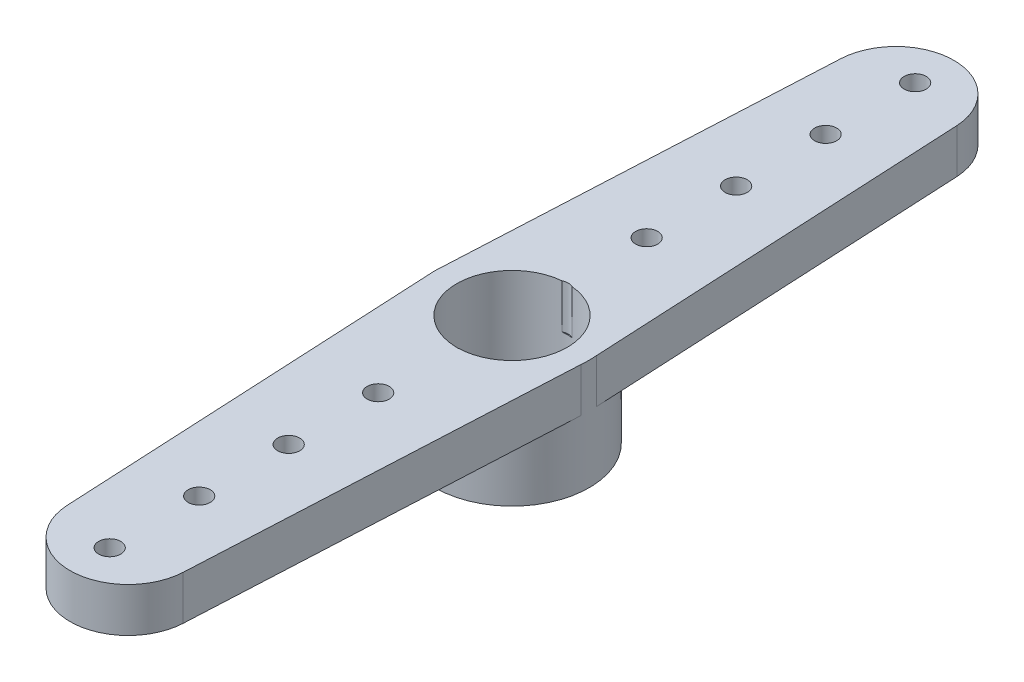
ISO-10303-21;
HEADER;
FILE_DESCRIPTION(('STEP AP214'),'2;1');
FILE_NAME('part.step','',(''),(''),'','','');
FILE_SCHEMA(('AUTOMOTIVE_DESIGN { 1 0 10303 214 1 1 1 1 }'));
ENDSEC;
DATA;
#1=APPLICATION_CONTEXT('core data for automotive mechanical design processes');
#2=APPLICATION_PROTOCOL_DEFINITION('international standard','automotive_design',2000,#1);
#3=PRODUCT_CONTEXT('',#1,'mechanical');
#4=PRODUCT('Part','Part','',(#3));
#5=PRODUCT_RELATED_PRODUCT_CATEGORY('part','',(#4));
#6=PRODUCT_DEFINITION_FORMATION('','',#4);
#7=PRODUCT_DEFINITION_CONTEXT('part definition',#1,'design');
#8=PRODUCT_DEFINITION('design','',#6,#7);
#9=PRODUCT_DEFINITION_SHAPE('','',#8);
#10=(LENGTH_UNIT() NAMED_UNIT(*) SI_UNIT(.MILLI.,.METRE.));
#11=(NAMED_UNIT(*) PLANE_ANGLE_UNIT() SI_UNIT($,.RADIAN.));
#12=(NAMED_UNIT(*) SI_UNIT($,.STERADIAN.) SOLID_ANGLE_UNIT());
#13=UNCERTAINTY_MEASURE_WITH_UNIT(LENGTH_MEASURE(1.E-05),#10,'distance_accuracy_value','');
#14=(GEOMETRIC_REPRESENTATION_CONTEXT(3) GLOBAL_UNCERTAINTY_ASSIGNED_CONTEXT((#13)) GLOBAL_UNIT_ASSIGNED_CONTEXT((#10,
#11,#12)) REPRESENTATION_CONTEXT('',''));
#15=CARTESIAN_POINT('',(0.,0.,0.));
#16=DIRECTION('',(0.,0.,1.));
#17=DIRECTION('',(1.,0.,0.));
#18=AXIS2_PLACEMENT_3D('',#15,#16,#17);
#19=CARTESIAN_POINT('',(0.,0.5,2.00608041372438));
#20=DIRECTION('',(0.,1.,0.));
#21=DIRECTION('',(0.,0.,1.));
#22=AXIS2_PLACEMENT_3D('',#19,#20,#21);
#23=CYLINDRICAL_SURFACE('',#22,0.5);
#24=DIRECTION('',(0.,-1.,0.));
#25=VECTOR('',#24,1.);
#26=CARTESIAN_POINT('',(-0.0867705995829963,2.5,2.49849371883301));
#27=LINE('',#26,#25);
#28=CARTESIAN_POINT('',(-0.0867705995829963,2.5,2.49849371883301));
#29=VERTEX_POINT('',#28);
#30=CARTESIAN_POINT('',(-0.0867705995829963,0.5,2.49849371883301));
#31=VERTEX_POINT('',#30);
#32=EDGE_CURVE('E383',#29,#31,#27,.T.);
#33=ORIENTED_EDGE('',*,*,#32,.F.);
#34=CARTESIAN_POINT('',(0.,2.5,2.00608041372438));
#35=DIRECTION('',(0.,1.,0.));
#36=DIRECTION('',(0.,0.,1.));
#37=AXIS2_PLACEMENT_3D('',#34,#35,#36);
#38=CIRCLE('',#37,0.5);
#39=CARTESIAN_POINT('',(0.0867705995829963,2.5,2.49849371883301));
#40=VERTEX_POINT('',#39);
#41=EDGE_CURVE('E410',#29,#40,#38,.T.);
#42=ORIENTED_EDGE('',*,*,#41,.T.);
#43=DIRECTION('',(0.,-1.,0.));
#44=VECTOR('',#43,1.);
#45=CARTESIAN_POINT('',(0.0867705995829963,2.5,2.49849371883301));
#46=LINE('',#45,#44);
#47=CARTESIAN_POINT('',(0.0867705995829963,0.5,2.49849371883301));
#48=VERTEX_POINT('',#47);
#49=EDGE_CURVE('E382',#48,#40,#46,.F.);
#50=ORIENTED_EDGE('',*,*,#49,.F.);
#51=CARTESIAN_POINT('',(0.,0.5,0.));
#52=DIRECTION('',(0.,1.,0.));
#53=DIRECTION('',(-0.0347082398331937,0.,0.999397487533204));
#54=AXIS2_PLACEMENT_3D('',#51,#52,#53);
#55=CIRCLE('',#54,2.5);
#56=EDGE_CURVE('E160',#31,#48,#55,.T.);
#57=ORIENTED_EDGE('',*,*,#56,.F.);
#58=EDGE_LOOP('',(#33,#42,#50,#57));
#59=FACE_BOUND('',#58,.T.);
#60=ADVANCED_FACE('F42',(#59),#23,.F.);
#61=CARTESIAN_POINT('',(0.,0.5,-2.04391958627562));
#62=DIRECTION('',(0.,1.,0.));
#63=DIRECTION('',(0.,0.,1.));
#64=AXIS2_PLACEMENT_3D('',#61,#62,#63);
#65=CYLINDRICAL_SURFACE('',#64,0.5);
#66=DIRECTION('',(0.,-1.,0.));
#67=VECTOR('',#66,1.);
#68=CARTESIAN_POINT('',(0.226395537594533,2.5,-2.48972790894051));
#69=LINE('',#68,#67);
#70=CARTESIAN_POINT('',(0.226395537594534,2.5,-2.48972790894051));
#71=VERTEX_POINT('',#70);
#72=CARTESIAN_POINT('',(0.226395537594533,0.5,-2.48972790894051));
#73=VERTEX_POINT('',#72);
#74=EDGE_CURVE('E139',#71,#73,#69,.T.);
#75=ORIENTED_EDGE('',*,*,#74,.F.);
#76=CARTESIAN_POINT('',(0.,2.5,-2.04391958627562));
#77=DIRECTION('',(0.,1.,0.));
#78=DIRECTION('',(0.,0.,1.));
#79=AXIS2_PLACEMENT_3D('',#76,#77,#78);
#80=CIRCLE('',#79,0.5);
#81=CARTESIAN_POINT('',(-0.226395537594533,2.5,-2.48972790894051));
#82=VERTEX_POINT('',#81);
#83=EDGE_CURVE('E156',#71,#82,#80,.T.);
#84=ORIENTED_EDGE('',*,*,#83,.T.);
#85=DIRECTION('',(0.,-1.,0.));
#86=VECTOR('',#85,1.);
#87=CARTESIAN_POINT('',(-0.226395537594533,2.5,-2.48972790894051));
#88=LINE('',#87,#86);
#89=CARTESIAN_POINT('',(-0.226395537594531,0.5,-2.48972790894051));
#90=VERTEX_POINT('',#89);
#91=EDGE_CURVE('E149',#90,#82,#88,.F.);
#92=ORIENTED_EDGE('',*,*,#91,.F.);
#93=CARTESIAN_POINT('',(0.,0.5,-2.04391958627562));
#94=DIRECTION('',(0.,1.,0.));
#95=DIRECTION('',(0.,0.,1.));
#96=AXIS2_PLACEMENT_3D('',#93,#94,#95);
#97=CIRCLE('',#96,0.5);
#98=EDGE_CURVE('E152',#73,#90,#97,.T.);
#99=ORIENTED_EDGE('',*,*,#98,.F.);
#100=EDGE_LOOP('',(#75,#84,#92,#99));
#101=FACE_BOUND('',#100,.T.);
#102=ADVANCED_FACE('F153',(#101),#65,.F.);
#103=CARTESIAN_POINT('',(0.,2.5,17.3718769506874));
#104=DIRECTION('',(0.,1.,0.));
#105=DIRECTION('',(0.,0.,1.));
#106=AXIS2_PLACEMENT_3D('',#103,#104,#105);
#107=CYLINDRICAL_SURFACE('',#106,2.6281230493126);
#108=DIRECTION('',(0.,1.,0.));
#109=VECTOR('',#108,1.);
#110=CARTESIAN_POINT('',(2.62484404235973,0.5,17.5031191528054));
#111=LINE('',#110,#109);
#112=CARTESIAN_POINT('',(2.62484404235973,2.5,17.5031191528054));
#113=VERTEX_POINT('',#112);
#114=CARTESIAN_POINT('',(2.62484404235973,0.5,17.5031191528054));
#115=VERTEX_POINT('',#114);
#116=EDGE_CURVE('E376',#113,#115,#111,.F.);
#117=ORIENTED_EDGE('',*,*,#116,.F.);
#118=CARTESIAN_POINT('',(0.,2.5,17.3718769506874));
#119=DIRECTION('',(0.,1.,0.));
#120=DIRECTION('',(0.,0.,1.));
#121=AXIS2_PLACEMENT_3D('',#118,#119,#120);
#122=CIRCLE('',#121,2.6281230493126);
#123=CARTESIAN_POINT('',(-2.62484404235973,2.5,17.5031191528054));
#124=VERTEX_POINT('',#123);
#125=EDGE_CURVE('E54',#124,#113,#122,.T.);
#126=ORIENTED_EDGE('',*,*,#125,.F.);
#127=DIRECTION('',(0.,1.,0.));
#128=VECTOR('',#127,1.);
#129=CARTESIAN_POINT('',(-2.62484404235973,0.5,17.5031191528054));
#130=LINE('',#129,#128);
#131=CARTESIAN_POINT('',(-2.62484404235973,0.5,17.5031191528054));
#132=VERTEX_POINT('',#131);
#133=EDGE_CURVE('E379',#132,#124,#130,.T.);
#134=ORIENTED_EDGE('',*,*,#133,.F.);
#135=CARTESIAN_POINT('',(0.,0.499999999999999,17.3718769506874));
#136=DIRECTION('',(0.,1.,0.));
#137=DIRECTION('',(0.,0.,1.));
#138=AXIS2_PLACEMENT_3D('',#135,#136,#137);
#139=CIRCLE('',#138,2.6281230493126);
#140=EDGE_CURVE('E12',#115,#132,#139,.F.);
#141=ORIENTED_EDGE('',*,*,#140,.F.);
#142=EDGE_LOOP('',(#117,#126,#134,#141));
#143=FACE_BOUND('',#142,.T.);
#144=ADVANCED_FACE('F45',(#143),#107,.T.);
#145=CARTESIAN_POINT('',(0.,2.5,0.));
#146=DIRECTION('',(0.,1.,0.));
#147=DIRECTION('',(0.,0.,1.));
#148=AXIS2_PLACEMENT_3D('',#145,#146,#147);
#149=PLANE('',#148);
#150=CARTESIAN_POINT('',(0.,2.5,-10.1439195862756));
#151=DIRECTION('',(0.,1.,0.));
#152=DIRECTION('',(0.,0.,1.));
#153=AXIS2_PLACEMENT_3D('',#150,#151,#152);
#154=CIRCLE('',#153,0.5);
#155=CARTESIAN_POINT('',(0.,2.5,-9.64391958627562));
#156=VERTEX_POINT('',#155);
#157=EDGE_CURVE('E401',#156,#156,#154,.T.);
#158=ORIENTED_EDGE('',*,*,#157,.F.);
#159=EDGE_LOOP('',(#158));
#160=FACE_BOUND('',#159,.T.);
#161=CARTESIAN_POINT('',(0.,2.5,-6.09391958627562));
#162=DIRECTION('',(0.,1.,0.));
#163=DIRECTION('',(0.,0.,1.));
#164=AXIS2_PLACEMENT_3D('',#161,#162,#163);
#165=CIRCLE('',#164,0.5);
#166=CARTESIAN_POINT('',(0.,2.5,-5.59391958627562));
#167=VERTEX_POINT('',#166);
#168=EDGE_CURVE('E155',#167,#167,#165,.T.);
#169=ORIENTED_EDGE('',*,*,#168,.F.);
#170=EDGE_LOOP('',(#169));
#171=FACE_BOUND('',#170,.T.);
#172=ORIENTED_EDGE('',*,*,#41,.F.);
#173=CARTESIAN_POINT('',(0.,2.5,0.));
#174=DIRECTION('',(0.,1.,0.));
#175=DIRECTION('',(0.,0.,1.));
#176=AXIS2_PLACEMENT_3D('',#173,#174,#175);
#177=CIRCLE('',#176,2.5);
#178=EDGE_CURVE('E385',#29,#82,#177,.F.);
#179=ORIENTED_EDGE('',*,*,#178,.T.);
#180=ORIENTED_EDGE('',*,*,#83,.F.);
#181=EDGE_CURVE('E62',#71,#40,#177,.F.);
#182=ORIENTED_EDGE('',*,*,#181,.T.);
#183=EDGE_LOOP('',(#172,#179,#180,#182));
#184=FACE_BOUND('',#183,.T.);
#185=CARTESIAN_POINT('',(0.,2.5,6.05608041372438));
#186=DIRECTION('',(0.,1.,0.));
#187=DIRECTION('',(0.,0.,1.));
#188=AXIS2_PLACEMENT_3D('',#185,#186,#187);
#189=CIRCLE('',#188,0.5);
#190=CARTESIAN_POINT('',(0.,2.5,6.55608041372438));
#191=VERTEX_POINT('',#190);
#192=EDGE_CURVE('E415',#191,#191,#189,.T.);
#193=ORIENTED_EDGE('',*,*,#192,.F.);
#194=EDGE_LOOP('',(#193));
#195=FACE_BOUND('',#194,.T.);
#196=CARTESIAN_POINT('',(0.,2.5,10.1060804137244));
#197=DIRECTION('',(0.,1.,0.));
#198=DIRECTION('',(0.,0.,1.));
#199=AXIS2_PLACEMENT_3D('',#196,#197,#198);
#200=CIRCLE('',#199,0.5);
#201=CARTESIAN_POINT('',(0.,2.5,10.6060804137244));
#202=VERTEX_POINT('',#201);
#203=EDGE_CURVE('E421',#202,#202,#200,.T.);
#204=ORIENTED_EDGE('',*,*,#203,.F.);
#205=EDGE_LOOP('',(#204));
#206=FACE_BOUND('',#205,.T.);
#207=CARTESIAN_POINT('',(0.,2.5,14.1560804137244));
#208=DIRECTION('',(0.,1.,0.));
#209=DIRECTION('',(0.,0.,1.));
#210=AXIS2_PLACEMENT_3D('',#207,#208,#209);
#211=CIRCLE('',#210,0.5);
#212=CARTESIAN_POINT('',(0.,2.5,14.6560804137244));
#213=VERTEX_POINT('',#212);
#214=EDGE_CURVE('E427',#213,#213,#211,.T.);
#215=ORIENTED_EDGE('',*,*,#214,.F.);
#216=EDGE_LOOP('',(#215));
#217=FACE_BOUND('',#216,.T.);
#218=CARTESIAN_POINT('',(0.,2.5,18.2060804137244));
#219=DIRECTION('',(0.,1.,0.));
#220=DIRECTION('',(0.,0.,1.));
#221=AXIS2_PLACEMENT_3D('',#218,#219,#220);
#222=CIRCLE('',#221,0.5);
#223=CARTESIAN_POINT('',(0.,2.5,18.7060804137244));
#224=VERTEX_POINT('',#223);
#225=EDGE_CURVE('E168',#224,#224,#222,.T.);
#226=ORIENTED_EDGE('',*,*,#225,.F.);
#227=EDGE_LOOP('',(#226));
#228=FACE_BOUND('',#227,.T.);
#229=CARTESIAN_POINT('',(0.,2.5,-14.1939195862756));
#230=DIRECTION('',(0.,1.,0.));
#231=DIRECTION('',(0.,0.,1.));
#232=AXIS2_PLACEMENT_3D('',#229,#230,#231);
#233=CIRCLE('',#232,0.5);
#234=CARTESIAN_POINT('',(0.,2.5,-13.6939195862756));
#235=VERTEX_POINT('',#234);
#236=EDGE_CURVE('E400',#235,#235,#233,.T.);
#237=ORIENTED_EDGE('',*,*,#236,.F.);
#238=EDGE_LOOP('',(#237));
#239=FACE_BOUND('',#238,.T.);
#240=CARTESIAN_POINT('',(0.,2.5,-18.2439195862756));
#241=DIRECTION('',(0.,1.,0.));
#242=DIRECTION('',(0.,0.,1.));
#243=AXIS2_PLACEMENT_3D('',#240,#241,#242);
#244=CIRCLE('',#243,0.5);
#245=CARTESIAN_POINT('',(0.,2.5,-17.7439195862756));
#246=VERTEX_POINT('',#245);
#247=EDGE_CURVE('E442',#246,#246,#244,.T.);
#248=ORIENTED_EDGE('',*,*,#247,.F.);
#249=EDGE_LOOP('',(#248));
#250=FACE_BOUND('',#249,.T.);
#251=DIRECTION('',(0.0499376169438922,0.,0.998752338877845));
#252=VECTOR('',#251,1.);
#253=CARTESIAN_POINT('',(-3.5,2.5,0.));
#254=LINE('',#253,#252);
#255=CARTESIAN_POINT('',(-3.48254364089776,2.5,0.349127182044893));
#256=VERTEX_POINT('',#255);
#257=EDGE_CURVE('E446',#256,#124,#254,.T.);
#258=ORIENTED_EDGE('',*,*,#257,.T.);
#259=ORIENTED_EDGE('',*,*,#125,.T.);
#260=DIRECTION('',(0.0499376169438922,0.,-0.998752338877845));
#261=VECTOR('',#260,1.);
#262=CARTESIAN_POINT('',(3.5,2.5,0.));
#263=LINE('',#262,#261);
#264=CARTESIAN_POINT('',(3.48254364089776,2.5,0.349127182044893));
#265=VERTEX_POINT('',#264);
#266=EDGE_CURVE('E375',#113,#265,#263,.T.);
#267=ORIENTED_EDGE('',*,*,#266,.T.);
#268=CARTESIAN_POINT('',(3.48254364089776,2.5,0.349127182044893));
#269=DIRECTION('',(0.0499376169438926,0.,-0.998752338877845));
#270=VECTOR('',#269,1.);
#271=LINE('',#268,#270);
#272=CARTESIAN_POINT('',(3.5,2.5,0.));
#273=VERTEX_POINT('',#272);
#274=EDGE_CURVE('E380',#265,#273,#271,.T.);
#275=ORIENTED_EDGE('',*,*,#274,.T.);
#276=CARTESIAN_POINT('',(3.5,2.5,0.));
#277=DIRECTION('',(-0.0499376169438931,0.,-0.998752338877845));
#278=VECTOR('',#277,1.);
#279=LINE('',#276,#278);
#280=CARTESIAN_POINT('',(3.48254364089776,2.5,-0.349127182044893));
#281=VERTEX_POINT('',#280);
#282=EDGE_CURVE('E318',#273,#281,#279,.T.);
#283=ORIENTED_EDGE('',*,*,#282,.T.);
#284=DIRECTION('',(-0.0499376169438922,0.,-0.998752338877845));
#285=VECTOR('',#284,1.);
#286=CARTESIAN_POINT('',(3.5,2.5,0.));
#287=LINE('',#286,#285);
#288=CARTESIAN_POINT('',(2.62484404235973,2.5,-17.5031191528054));
#289=VERTEX_POINT('',#288);
#290=EDGE_CURVE('E366',#281,#289,#287,.T.);
#291=ORIENTED_EDGE('',*,*,#290,.T.);
#292=CARTESIAN_POINT('',(0.,2.5,-17.3718769506874));
#293=DIRECTION('',(0.,1.,0.));
#294=DIRECTION('',(0.,0.,1.));
#295=AXIS2_PLACEMENT_3D('',#292,#293,#294);
#296=CIRCLE('',#295,2.6281230493126);
#297=CARTESIAN_POINT('',(-2.62484404235973,2.5,-17.5031191528054));
#298=VERTEX_POINT('',#297);
#299=EDGE_CURVE('E349',#289,#298,#296,.T.);
#300=ORIENTED_EDGE('',*,*,#299,.T.);
#301=DIRECTION('',(-0.0499376169438922,0.,0.998752338877845));
#302=VECTOR('',#301,1.);
#303=CARTESIAN_POINT('',(-3.5,2.5,0.));
#304=LINE('',#303,#302);
#305=CARTESIAN_POINT('',(-3.48254364089776,2.5,-0.349127182044893));
#306=VERTEX_POINT('',#305);
#307=EDGE_CURVE('E314',#298,#306,#304,.T.);
#308=ORIENTED_EDGE('',*,*,#307,.T.);
#309=CARTESIAN_POINT('',(-3.48254364089776,2.5,-0.349127182044893));
#310=DIRECTION('',(-0.0499376169438931,0.,0.998752338877845));
#311=VECTOR('',#310,1.);
#312=LINE('',#309,#311);
#313=CARTESIAN_POINT('',(-3.5,2.5,0.));
#314=VERTEX_POINT('',#313);
#315=EDGE_CURVE('E311',#306,#314,#312,.T.);
#316=ORIENTED_EDGE('',*,*,#315,.T.);
#317=CARTESIAN_POINT('',(-3.5,2.5,0.));
#318=DIRECTION('',(0.0499376169438931,0.,0.998752338877845));
#319=VECTOR('',#318,1.);
#320=LINE('',#317,#319);
#321=EDGE_CURVE('E281',#314,#256,#320,.T.);
#322=ORIENTED_EDGE('',*,*,#321,.T.);
#323=EDGE_LOOP('',(#258,#259,#267,#275,#283,#291,#300,#308,#316,#322));
#324=FACE_BOUND('',#323,.T.);
#325=ADVANCED_FACE('F243',(#160,#171,#184,#195,#206,#217,#228,#239,#250,#324),#149,.T.);
#326=CARTESIAN_POINT('',(0.,2.5,0.));
#327=DIRECTION('',(0.,-1.,0.));
#328=DIRECTION('',(0.,0.,-1.));
#329=AXIS2_PLACEMENT_3D('',#326,#327,#328);
#330=CYLINDRICAL_SURFACE('',#329,2.5);
#331=ORIENTED_EDGE('',*,*,#56,.T.);
#332=ORIENTED_EDGE('',*,*,#49,.T.);
#333=ORIENTED_EDGE('',*,*,#181,.F.);
#334=ORIENTED_EDGE('',*,*,#74,.T.);
#335=CARTESIAN_POINT('',(0.,0.499999999999999,0.));
#336=DIRECTION('',(0.,1.,0.));
#337=DIRECTION('',(0.,0.,1.));
#338=AXIS2_PLACEMENT_3D('',#335,#336,#337);
#339=CIRCLE('',#338,2.5);
#340=EDGE_CURVE('E145',#73,#90,#339,.T.);
#341=ORIENTED_EDGE('',*,*,#340,.T.);
#342=ORIENTED_EDGE('',*,*,#91,.T.);
#343=ORIENTED_EDGE('',*,*,#178,.F.);
#344=ORIENTED_EDGE('',*,*,#32,.T.);
#345=EDGE_LOOP('',(#331,#332,#333,#334,#341,#342,#343,#344));
#346=FACE_BOUND('',#345,.T.);
#347=CARTESIAN_POINT('',(0.,-2.5,0.));
#348=DIRECTION('',(0.,1.,0.));
#349=DIRECTION('',(0.,0.,1.));
#350=AXIS2_PLACEMENT_3D('',#347,#348,#349);
#351=CIRCLE('',#350,2.5);
#352=CARTESIAN_POINT('',(0.,-2.5,2.5));
#353=VERTEX_POINT('',#352);
#354=EDGE_CURVE('E338',#353,#353,#351,.T.);
#355=ORIENTED_EDGE('',*,*,#354,.F.);
#356=EDGE_LOOP('',(#355));
#357=FACE_BOUND('',#356,.T.);
#358=ADVANCED_FACE('F142',(#346,#357),#330,.F.);
#359=CARTESIAN_POINT('',(0.,2.5,-17.3718769506874));
#360=DIRECTION('',(0.,1.,0.));
#361=DIRECTION('',(0.,0.,1.));
#362=AXIS2_PLACEMENT_3D('',#359,#360,#361);
#363=CYLINDRICAL_SURFACE('',#362,2.6281230493126);
#364=DIRECTION('',(0.,1.,0.));
#365=VECTOR('',#364,1.);
#366=CARTESIAN_POINT('',(-2.62484404235973,0.5,-17.5031191528054));
#367=LINE('',#366,#365);
#368=CARTESIAN_POINT('',(-2.62484404235973,0.5,-17.5031191528054));
#369=VERTEX_POINT('',#368);
#370=EDGE_CURVE('E317',#298,#369,#367,.F.);
#371=ORIENTED_EDGE('',*,*,#370,.F.);
#372=ORIENTED_EDGE('',*,*,#299,.F.);
#373=DIRECTION('',(0.,1.,0.));
#374=VECTOR('',#373,1.);
#375=CARTESIAN_POINT('',(2.62484404235973,0.5,-17.5031191528054));
#376=LINE('',#375,#374);
#377=CARTESIAN_POINT('',(2.62484404235973,0.5,-17.5031191528054));
#378=VERTEX_POINT('',#377);
#379=EDGE_CURVE('E320',#378,#289,#376,.T.);
#380=ORIENTED_EDGE('',*,*,#379,.F.);
#381=CARTESIAN_POINT('',(0.,0.499999999999999,-17.3718769506874));
#382=DIRECTION('',(0.,1.,0.));
#383=DIRECTION('',(0.,0.,1.));
#384=AXIS2_PLACEMENT_3D('',#381,#382,#383);
#385=CIRCLE('',#384,2.6281230493126);
#386=EDGE_CURVE('E351',#369,#378,#385,.F.);
#387=ORIENTED_EDGE('',*,*,#386,.F.);
#388=EDGE_LOOP('',(#371,#372,#380,#387));
#389=FACE_BOUND('',#388,.T.);
#390=ADVANCED_FACE('F242',(#389),#363,.T.);
#391=CARTESIAN_POINT('',(0.,-2.5,0.));
#392=DIRECTION('',(0.,1.,0.));
#393=DIRECTION('',(0.,0.,1.));
#394=AXIS2_PLACEMENT_3D('',#391,#392,#393);
#395=PLANE('',#394);
#396=CARTESIAN_POINT('',(0.,-2.5,0.));
#397=DIRECTION('',(0.,1.,0.));
#398=DIRECTION('',(0.,0.,1.));
#399=AXIS2_PLACEMENT_3D('',#396,#397,#398);
#400=CIRCLE('',#399,3.5);
#401=CARTESIAN_POINT('',(0.,-2.5,3.5));
#402=VERTEX_POINT('',#401);
#403=EDGE_CURVE('E165',#402,#402,#400,.T.);
#404=ORIENTED_EDGE('',*,*,#403,.F.);
#405=EDGE_LOOP('',(#404));
#406=FACE_BOUND('',#405,.T.);
#407=ORIENTED_EDGE('',*,*,#354,.T.);
#408=EDGE_LOOP('',(#407));
#409=FACE_BOUND('',#408,.T.);
#410=ADVANCED_FACE('F248',(#406,#409),#395,.F.);
#411=CARTESIAN_POINT('',(0.,2.5,0.));
#412=DIRECTION('',(0.,-1.,0.));
#413=DIRECTION('',(0.,0.,-1.));
#414=AXIS2_PLACEMENT_3D('',#411,#412,#413);
#415=CYLINDRICAL_SURFACE('',#414,3.5);
#416=CARTESIAN_POINT('',(0.,0.499999999999999,0.));
#417=DIRECTION('',(0.,1.,0.));
#418=DIRECTION('',(0.,0.,1.));
#419=AXIS2_PLACEMENT_3D('',#416,#417,#418);
#420=CIRCLE('',#419,3.5);
#421=CARTESIAN_POINT('',(-3.48254364089776,0.499999999999999,0.349127182044893));
#422=VERTEX_POINT('',#421);
#423=CARTESIAN_POINT('',(3.48254364089776,0.499999999999999,0.349127182044893));
#424=VERTEX_POINT('',#423);
#425=EDGE_CURVE('E363',#422,#424,#420,.T.);
#426=ORIENTED_EDGE('',*,*,#425,.F.);
#427=DIRECTION('',(0.,-1.,0.));
#428=VECTOR('',#427,1.);
#429=CARTESIAN_POINT('',(-3.48254364089776,2.5,0.349127182044879));
#430=LINE('',#429,#428);
#431=EDGE_CURVE('E353',#422,#256,#430,.F.);
#432=ORIENTED_EDGE('',*,*,#431,.T.);
#433=ORIENTED_EDGE('',*,*,#321,.F.);
#434=ORIENTED_EDGE('',*,*,#315,.F.);
#435=DIRECTION('',(0.,-1.,0.));
#436=VECTOR('',#435,1.);
#437=CARTESIAN_POINT('',(-3.48254364089776,2.5,-0.349127182044879));
#438=LINE('',#437,#436);
#439=CARTESIAN_POINT('',(-3.48254364089776,0.499999999999999,-0.349127182044893));
#440=VERTEX_POINT('',#439);
#441=EDGE_CURVE('E163',#306,#440,#438,.T.);
#442=ORIENTED_EDGE('',*,*,#441,.T.);
#443=CARTESIAN_POINT('',(0.,0.499999999999999,0.));
#444=DIRECTION('',(0.,1.,0.));
#445=DIRECTION('',(0.,0.,1.));
#446=AXIS2_PLACEMENT_3D('',#443,#444,#445);
#447=CIRCLE('',#446,3.5);
#448=CARTESIAN_POINT('',(3.48254364089776,0.499999999999999,-0.349127182044893));
#449=VERTEX_POINT('',#448);
#450=EDGE_CURVE('E335',#449,#440,#447,.T.);
#451=ORIENTED_EDGE('',*,*,#450,.F.);
#452=DIRECTION('',(0.,-1.,0.));
#453=VECTOR('',#452,1.);
#454=CARTESIAN_POINT('',(3.48254364089776,2.5,-0.349127182044879));
#455=LINE('',#454,#453);
#456=EDGE_CURVE('E159',#449,#281,#455,.F.);
#457=ORIENTED_EDGE('',*,*,#456,.T.);
#458=ORIENTED_EDGE('',*,*,#282,.F.);
#459=ORIENTED_EDGE('',*,*,#274,.F.);
#460=DIRECTION('',(0.,-1.,0.));
#461=VECTOR('',#460,1.);
#462=CARTESIAN_POINT('',(3.48254364089776,2.5,0.349127182044879));
#463=LINE('',#462,#461);
#464=EDGE_CURVE('E354',#265,#424,#463,.T.);
#465=ORIENTED_EDGE('',*,*,#464,.T.);
#466=EDGE_LOOP('',(#426,#432,#433,#434,#442,#451,#457,#458,#459,#465));
#467=FACE_BOUND('',#466,.T.);
#468=ORIENTED_EDGE('',*,*,#403,.T.);
#469=EDGE_LOOP('',(#468));
#470=FACE_BOUND('',#469,.T.);
#471=ADVANCED_FACE('F235',(#467,#470),#415,.T.);
#472=CARTESIAN_POINT('',(-3.5,0.5,0.));
#473=DIRECTION('',(-0.998752338877845,0.,-0.0499376169438922));
#474=DIRECTION('',(-0.0499376169438922,0.,0.998752338877845));
#475=AXIS2_PLACEMENT_3D('',#472,#473,#474);
#476=PLANE('',#475);
#477=ORIENTED_EDGE('',*,*,#307,.F.);
#478=ORIENTED_EDGE('',*,*,#370,.T.);
#479=DIRECTION('',(-0.0499376169438922,0.,0.998752338877845));
#480=VECTOR('',#479,1.);
#481=CARTESIAN_POINT('',(-3.5,0.5,0.));
#482=LINE('',#481,#480);
#483=EDGE_CURVE('E339',#369,#440,#482,.T.);
#484=ORIENTED_EDGE('',*,*,#483,.T.);
#485=ORIENTED_EDGE('',*,*,#441,.F.);
#486=EDGE_LOOP('',(#477,#478,#484,#485));
#487=FACE_BOUND('',#486,.T.);
#488=ADVANCED_FACE('F232',(#487),#476,.T.);
#489=CARTESIAN_POINT('',(3.5,0.5,0.));
#490=DIRECTION('',(0.998752338877845,0.,-0.0499376169438922));
#491=DIRECTION('',(-0.0499376169438922,0.,-0.998752338877845));
#492=AXIS2_PLACEMENT_3D('',#489,#490,#491);
#493=PLANE('',#492);
#494=DIRECTION('',(-0.0499376169438922,0.,-0.998752338877845));
#495=VECTOR('',#494,1.);
#496=CARTESIAN_POINT('',(3.5,0.5,0.));
#497=LINE('',#496,#495);
#498=EDGE_CURVE('E344',#449,#378,#497,.T.);
#499=ORIENTED_EDGE('',*,*,#498,.T.);
#500=ORIENTED_EDGE('',*,*,#379,.T.);
#501=ORIENTED_EDGE('',*,*,#290,.F.);
#502=ORIENTED_EDGE('',*,*,#456,.F.);
#503=EDGE_LOOP('',(#499,#500,#501,#502));
#504=FACE_BOUND('',#503,.T.);
#505=ADVANCED_FACE('F230',(#504),#493,.T.);
#506=CARTESIAN_POINT('',(0.,0.499999999999999,0.));
#507=DIRECTION('',(0.,1.,0.));
#508=DIRECTION('',(0.,0.,1.));
#509=AXIS2_PLACEMENT_3D('',#506,#507,#508);
#510=PLANE('',#509);
#511=CARTESIAN_POINT('',(0.,0.5,-10.1439195862756));
#512=DIRECTION('',(0.,1.,0.));
#513=DIRECTION('',(0.,0.,1.));
#514=AXIS2_PLACEMENT_3D('',#511,#512,#513);
#515=CIRCLE('',#514,0.5);
#516=CARTESIAN_POINT('',(0.,0.5,-9.64391958627562));
#517=VERTEX_POINT('',#516);
#518=EDGE_CURVE('E397',#517,#517,#515,.T.);
#519=ORIENTED_EDGE('',*,*,#518,.T.);
#520=EDGE_LOOP('',(#519));
#521=FACE_BOUND('',#520,.T.);
#522=CARTESIAN_POINT('',(0.,0.5,-6.09391958627562));
#523=DIRECTION('',(0.,1.,0.));
#524=DIRECTION('',(0.,0.,1.));
#525=AXIS2_PLACEMENT_3D('',#522,#523,#524);
#526=CIRCLE('',#525,0.5);
#527=CARTESIAN_POINT('',(0.,0.5,-5.59391958627562));
#528=VERTEX_POINT('',#527);
#529=EDGE_CURVE('E404',#528,#528,#526,.T.);
#530=ORIENTED_EDGE('',*,*,#529,.T.);
#531=EDGE_LOOP('',(#530));
#532=FACE_BOUND('',#531,.T.);
#533=CARTESIAN_POINT('',(0.,0.5,-14.1939195862756));
#534=DIRECTION('',(0.,1.,0.));
#535=DIRECTION('',(0.,0.,1.));
#536=AXIS2_PLACEMENT_3D('',#533,#534,#535);
#537=CIRCLE('',#536,0.5);
#538=CARTESIAN_POINT('',(0.,0.5,-13.6939195862756));
#539=VERTEX_POINT('',#538);
#540=EDGE_CURVE('E178',#539,#539,#537,.T.);
#541=ORIENTED_EDGE('',*,*,#540,.T.);
#542=EDGE_LOOP('',(#541));
#543=FACE_BOUND('',#542,.T.);
#544=CARTESIAN_POINT('',(0.,0.5,-18.2439195862756));
#545=DIRECTION('',(0.,1.,0.));
#546=DIRECTION('',(0.,0.,1.));
#547=AXIS2_PLACEMENT_3D('',#544,#545,#546);
#548=CIRCLE('',#547,0.5);
#549=CARTESIAN_POINT('',(0.,0.5,-17.7439195862756));
#550=VERTEX_POINT('',#549);
#551=EDGE_CURVE('E444',#550,#550,#548,.T.);
#552=ORIENTED_EDGE('',*,*,#551,.T.);
#553=EDGE_LOOP('',(#552));
#554=FACE_BOUND('',#553,.T.);
#555=ORIENTED_EDGE('',*,*,#483,.F.);
#556=ORIENTED_EDGE('',*,*,#386,.T.);
#557=ORIENTED_EDGE('',*,*,#498,.F.);
#558=ORIENTED_EDGE('',*,*,#450,.T.);
#559=EDGE_LOOP('',(#555,#556,#557,#558));
#560=FACE_BOUND('',#559,.T.);
#561=ADVANCED_FACE('F223',(#521,#532,#543,#554,#560),#510,.F.);
#562=CARTESIAN_POINT('',(3.5,0.5,0.));
#563=DIRECTION('',(0.998752338877845,0.,0.0499376169438922));
#564=DIRECTION('',(0.0499376169438922,0.,-0.998752338877845));
#565=AXIS2_PLACEMENT_3D('',#562,#563,#564);
#566=PLANE('',#565);
#567=ORIENTED_EDGE('',*,*,#266,.F.);
#568=ORIENTED_EDGE('',*,*,#116,.T.);
#569=DIRECTION('',(0.0499376169438922,0.,-0.998752338877845));
#570=VECTOR('',#569,1.);
#571=CARTESIAN_POINT('',(3.5,0.5,0.));
#572=LINE('',#571,#570);
#573=EDGE_CURVE('E367',#115,#424,#572,.T.);
#574=ORIENTED_EDGE('',*,*,#573,.T.);
#575=ORIENTED_EDGE('',*,*,#464,.F.);
#576=EDGE_LOOP('',(#567,#568,#574,#575));
#577=FACE_BOUND('',#576,.T.);
#578=ADVANCED_FACE('F220',(#577),#566,.T.);
#579=CARTESIAN_POINT('',(-3.5,0.5,0.));
#580=DIRECTION('',(-0.998752338877845,0.,0.0499376169438922));
#581=DIRECTION('',(0.0499376169438922,0.,0.998752338877845));
#582=AXIS2_PLACEMENT_3D('',#579,#580,#581);
#583=PLANE('',#582);
#584=DIRECTION('',(0.0499376169438922,0.,0.998752338877845));
#585=VECTOR('',#584,1.);
#586=CARTESIAN_POINT('',(-3.5,0.5,0.));
#587=LINE('',#586,#585);
#588=EDGE_CURVE('E374',#422,#132,#587,.T.);
#589=ORIENTED_EDGE('',*,*,#588,.T.);
#590=ORIENTED_EDGE('',*,*,#133,.T.);
#591=ORIENTED_EDGE('',*,*,#257,.F.);
#592=ORIENTED_EDGE('',*,*,#431,.F.);
#593=EDGE_LOOP('',(#589,#590,#591,#592));
#594=FACE_BOUND('',#593,.T.);
#595=ADVANCED_FACE('F218',(#594),#583,.T.);
#596=CARTESIAN_POINT('',(0.,0.499999999999999,0.));
#597=DIRECTION('',(0.,1.,0.));
#598=DIRECTION('',(0.,0.,-1.));
#599=AXIS2_PLACEMENT_3D('',#596,#597,#598);
#600=PLANE('',#599);
#601=CARTESIAN_POINT('',(0.,0.5,6.05608041372438));
#602=DIRECTION('',(0.,1.,0.));
#603=DIRECTION('',(0.,0.,1.));
#604=AXIS2_PLACEMENT_3D('',#601,#602,#603);
#605=CIRCLE('',#604,0.5);
#606=CARTESIAN_POINT('',(0.,0.5,6.55608041372438));
#607=VERTEX_POINT('',#606);
#608=EDGE_CURVE('E412',#607,#607,#605,.T.);
#609=ORIENTED_EDGE('',*,*,#608,.T.);
#610=EDGE_LOOP('',(#609));
#611=FACE_BOUND('',#610,.T.);
#612=CARTESIAN_POINT('',(0.,0.5,10.1060804137244));
#613=DIRECTION('',(0.,1.,0.));
#614=DIRECTION('',(0.,0.,1.));
#615=AXIS2_PLACEMENT_3D('',#612,#613,#614);
#616=CIRCLE('',#615,0.5);
#617=CARTESIAN_POINT('',(0.,0.5,10.6060804137244));
#618=VERTEX_POINT('',#617);
#619=EDGE_CURVE('E418',#618,#618,#616,.T.);
#620=ORIENTED_EDGE('',*,*,#619,.T.);
#621=EDGE_LOOP('',(#620));
#622=FACE_BOUND('',#621,.T.);
#623=CARTESIAN_POINT('',(0.,0.5,14.1560804137244));
#624=DIRECTION('',(0.,1.,0.));
#625=DIRECTION('',(0.,0.,1.));
#626=AXIS2_PLACEMENT_3D('',#623,#624,#625);
#627=CIRCLE('',#626,0.5);
#628=CARTESIAN_POINT('',(0.,0.5,14.6560804137244));
#629=VERTEX_POINT('',#628);
#630=EDGE_CURVE('E424',#629,#629,#627,.T.);
#631=ORIENTED_EDGE('',*,*,#630,.T.);
#632=EDGE_LOOP('',(#631));
#633=FACE_BOUND('',#632,.T.);
#634=CARTESIAN_POINT('',(0.,0.5,18.2060804137244));
#635=DIRECTION('',(0.,1.,0.));
#636=DIRECTION('',(0.,0.,1.));
#637=AXIS2_PLACEMENT_3D('',#634,#635,#636);
#638=CIRCLE('',#637,0.5);
#639=CARTESIAN_POINT('',(0.,0.5,18.7060804137244));
#640=VERTEX_POINT('',#639);
#641=EDGE_CURVE('E390',#640,#640,#638,.T.);
#642=ORIENTED_EDGE('',*,*,#641,.T.);
#643=EDGE_LOOP('',(#642));
#644=FACE_BOUND('',#643,.T.);
#645=ORIENTED_EDGE('',*,*,#573,.F.);
#646=ORIENTED_EDGE('',*,*,#140,.T.);
#647=ORIENTED_EDGE('',*,*,#588,.F.);
#648=ORIENTED_EDGE('',*,*,#425,.T.);
#649=EDGE_LOOP('',(#645,#646,#647,#648));
#650=FACE_BOUND('',#649,.T.);
#651=ADVANCED_FACE('F214',(#611,#622,#633,#644,#650),#600,.F.);
#652=CARTESIAN_POINT('',(0.,0.5,-18.2439195862756));
#653=DIRECTION('',(0.,1.,0.));
#654=DIRECTION('',(0.,0.,1.));
#655=AXIS2_PLACEMENT_3D('',#652,#653,#654);
#656=CYLINDRICAL_SURFACE('',#655,0.5);
#657=ORIENTED_EDGE('',*,*,#551,.F.);
#658=EDGE_LOOP('',(#657));
#659=FACE_BOUND('',#658,.T.);
#660=ORIENTED_EDGE('',*,*,#247,.T.);
#661=EDGE_LOOP('',(#660));
#662=FACE_BOUND('',#661,.T.);
#663=ADVANCED_FACE('F210',(#659,#662),#656,.F.);
#664=CARTESIAN_POINT('',(0.,0.5,-14.1939195862756));
#665=DIRECTION('',(0.,1.,0.));
#666=DIRECTION('',(0.,0.,1.));
#667=AXIS2_PLACEMENT_3D('',#664,#665,#666);
#668=CYLINDRICAL_SURFACE('',#667,0.5);
#669=ORIENTED_EDGE('',*,*,#540,.F.);
#670=EDGE_LOOP('',(#669));
#671=FACE_BOUND('',#670,.T.);
#672=ORIENTED_EDGE('',*,*,#236,.T.);
#673=EDGE_LOOP('',(#672));
#674=FACE_BOUND('',#673,.T.);
#675=ADVANCED_FACE('F206',(#671,#674),#668,.F.);
#676=CARTESIAN_POINT('',(0.,0.5,18.2060804137244));
#677=DIRECTION('',(0.,1.,0.));
#678=DIRECTION('',(0.,0.,1.));
#679=AXIS2_PLACEMENT_3D('',#676,#677,#678);
#680=CYLINDRICAL_SURFACE('',#679,0.5);
#681=ORIENTED_EDGE('',*,*,#641,.F.);
#682=EDGE_LOOP('',(#681));
#683=FACE_BOUND('',#682,.T.);
#684=ORIENTED_EDGE('',*,*,#225,.T.);
#685=EDGE_LOOP('',(#684));
#686=FACE_BOUND('',#685,.T.);
#687=ADVANCED_FACE('F202',(#683,#686),#680,.F.);
#688=CARTESIAN_POINT('',(0.,0.5,14.1560804137244));
#689=DIRECTION('',(0.,1.,0.));
#690=DIRECTION('',(0.,0.,1.));
#691=AXIS2_PLACEMENT_3D('',#688,#689,#690);
#692=CYLINDRICAL_SURFACE('',#691,0.5);
#693=ORIENTED_EDGE('',*,*,#630,.F.);
#694=EDGE_LOOP('',(#693));
#695=FACE_BOUND('',#694,.T.);
#696=ORIENTED_EDGE('',*,*,#214,.T.);
#697=EDGE_LOOP('',(#696));
#698=FACE_BOUND('',#697,.T.);
#699=ADVANCED_FACE('F198',(#695,#698),#692,.F.);
#700=CARTESIAN_POINT('',(0.,0.5,10.1060804137244));
#701=DIRECTION('',(0.,1.,0.));
#702=DIRECTION('',(0.,0.,1.));
#703=AXIS2_PLACEMENT_3D('',#700,#701,#702);
#704=CYLINDRICAL_SURFACE('',#703,0.5);
#705=ORIENTED_EDGE('',*,*,#619,.F.);
#706=EDGE_LOOP('',(#705));
#707=FACE_BOUND('',#706,.T.);
#708=ORIENTED_EDGE('',*,*,#203,.T.);
#709=EDGE_LOOP('',(#708));
#710=FACE_BOUND('',#709,.T.);
#711=ADVANCED_FACE('F194',(#707,#710),#704,.F.);
#712=CARTESIAN_POINT('',(0.,0.5,6.05608041372438));
#713=DIRECTION('',(0.,1.,0.));
#714=DIRECTION('',(0.,0.,1.));
#715=AXIS2_PLACEMENT_3D('',#712,#713,#714);
#716=CYLINDRICAL_SURFACE('',#715,0.5);
#717=ORIENTED_EDGE('',*,*,#608,.F.);
#718=EDGE_LOOP('',(#717));
#719=FACE_BOUND('',#718,.T.);
#720=ORIENTED_EDGE('',*,*,#192,.T.);
#721=EDGE_LOOP('',(#720));
#722=FACE_BOUND('',#721,.T.);
#723=ADVANCED_FACE('F190',(#719,#722),#716,.F.);
#724=CARTESIAN_POINT('',(0.,0.5,-6.09391958627562));
#725=DIRECTION('',(0.,1.,0.));
#726=DIRECTION('',(0.,0.,1.));
#727=AXIS2_PLACEMENT_3D('',#724,#725,#726);
#728=CYLINDRICAL_SURFACE('',#727,0.5);
#729=ORIENTED_EDGE('',*,*,#529,.F.);
#730=EDGE_LOOP('',(#729));
#731=FACE_BOUND('',#730,.T.);
#732=ORIENTED_EDGE('',*,*,#168,.T.);
#733=EDGE_LOOP('',(#732));
#734=FACE_BOUND('',#733,.T.);
#735=ADVANCED_FACE('F193',(#731,#734),#728,.F.);
#736=CARTESIAN_POINT('',(0.,0.5,-10.1439195862756));
#737=DIRECTION('',(0.,1.,0.));
#738=DIRECTION('',(0.,0.,1.));
#739=AXIS2_PLACEMENT_3D('',#736,#737,#738);
#740=CYLINDRICAL_SURFACE('',#739,0.5);
#741=ORIENTED_EDGE('',*,*,#518,.F.);
#742=EDGE_LOOP('',(#741));
#743=FACE_BOUND('',#742,.T.);
#744=ORIENTED_EDGE('',*,*,#157,.T.);
#745=EDGE_LOOP('',(#744));
#746=FACE_BOUND('',#745,.T.);
#747=ADVANCED_FACE('F511',(#743,#746),#740,.F.);
#748=CARTESIAN_POINT('',(0.,0.5,-2.04391958627562));
#749=DIRECTION('',(0.,1.,0.));
#750=DIRECTION('',(0.,0.,1.));
#751=AXIS2_PLACEMENT_3D('',#748,#749,#750);
#752=PLANE('',#751);
#753=ORIENTED_EDGE('',*,*,#98,.T.);
#754=ORIENTED_EDGE('',*,*,#340,.F.);
#755=EDGE_LOOP('',(#753,#754));
#756=FACE_BOUND('',#755,.T.);
#757=ADVANCED_FACE('F158',(#756),#752,.T.);
#758=CLOSED_SHELL('',(#60,#102,#144,#325,#358,#390,#410,#471,#488,#505,#561,#578,#595,#651,#663,
#675,#687,#699,#711,#723,#735,#747,#757));
#759=MANIFOLD_SOLID_BREP('B2',#758);
#760=ADVANCED_BREP_SHAPE_REPRESENTATION('',(#18,#759),#14);
#761=SHAPE_DEFINITION_REPRESENTATION(#9,#760);
ENDSEC;
END-ISO-10303-21;
